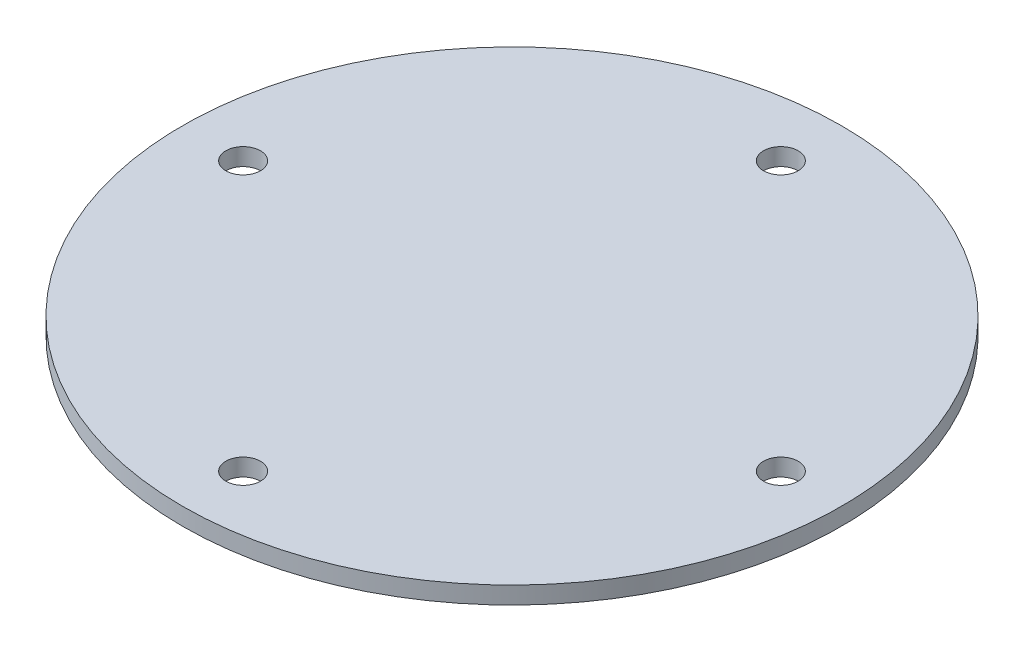
ISO-10303-21;
HEADER;
FILE_DESCRIPTION(('STEP AP214'),'2;1');
FILE_NAME('part.step','',(''),(''),'','','');
FILE_SCHEMA(('AUTOMOTIVE_DESIGN { 1 0 10303 214 1 1 1 1 }'));
ENDSEC;
DATA;
#1=APPLICATION_CONTEXT('core data for automotive mechanical design processes');
#2=APPLICATION_PROTOCOL_DEFINITION('international standard','automotive_design',2000,#1);
#3=PRODUCT_CONTEXT('',#1,'mechanical');
#4=PRODUCT('Part','Part','',(#3));
#5=PRODUCT_RELATED_PRODUCT_CATEGORY('part','',(#4));
#6=PRODUCT_DEFINITION_FORMATION('','',#4);
#7=PRODUCT_DEFINITION_CONTEXT('part definition',#1,'design');
#8=PRODUCT_DEFINITION('design','',#6,#7);
#9=PRODUCT_DEFINITION_SHAPE('','',#8);
#10=(LENGTH_UNIT() NAMED_UNIT(*) SI_UNIT(.MILLI.,.METRE.));
#11=(NAMED_UNIT(*) PLANE_ANGLE_UNIT() SI_UNIT($,.RADIAN.));
#12=(NAMED_UNIT(*) SI_UNIT($,.STERADIAN.) SOLID_ANGLE_UNIT());
#13=UNCERTAINTY_MEASURE_WITH_UNIT(LENGTH_MEASURE(1.E-05),#10,'distance_accuracy_value','');
#14=(GEOMETRIC_REPRESENTATION_CONTEXT(3) GLOBAL_UNCERTAINTY_ASSIGNED_CONTEXT((#13)) GLOBAL_UNIT_ASSIGNED_CONTEXT((#10,
#11,#12)) REPRESENTATION_CONTEXT('',''));
#15=CARTESIAN_POINT('',(0.,0.,0.));
#16=DIRECTION('',(0.,0.,1.));
#17=DIRECTION('',(1.,0.,0.));
#18=AXIS2_PLACEMENT_3D('',#15,#16,#17);
#19=CARTESIAN_POINT('',(0.,-8.,0.));
#20=DIRECTION('',(0.,1.,0.));
#21=DIRECTION('',(0.,0.,1.));
#22=AXIS2_PLACEMENT_3D('',#19,#20,#21);
#23=CYLINDRICAL_SURFACE('',#22,23.5);
#24=CARTESIAN_POINT('',(0.,-8.,0.));
#25=DIRECTION('',(0.,1.,0.));
#26=DIRECTION('',(0.,0.,1.));
#27=AXIS2_PLACEMENT_3D('',#24,#25,#26);
#28=CIRCLE('',#27,23.5);
#29=CARTESIAN_POINT('',(0.,-8.,23.5));
#30=VERTEX_POINT('',#29);
#31=EDGE_CURVE('E10',#30,#30,#28,.T.);
#32=ORIENTED_EDGE('',*,*,#31,.T.);
#33=EDGE_LOOP('',(#32));
#34=FACE_BOUND('',#33,.T.);
#35=CARTESIAN_POINT('',(0.,-2.,0.));
#36=DIRECTION('',(0.,1.,0.));
#37=DIRECTION('',(0.,0.,1.));
#38=AXIS2_PLACEMENT_3D('',#35,#36,#37);
#39=CIRCLE('',#38,23.5);
#40=CARTESIAN_POINT('',(0.,-2.,23.5));
#41=VERTEX_POINT('',#40);
#42=EDGE_CURVE('E34',#41,#41,#39,.F.);
#43=ORIENTED_EDGE('',*,*,#42,.T.);
#44=EDGE_LOOP('',(#43));
#45=FACE_BOUND('',#44,.T.);
#46=ADVANCED_FACE('F31',(#34,#45),#23,.T.);
#47=CARTESIAN_POINT('',(0.,-8.,0.));
#48=DIRECTION('',(0.,1.,0.));
#49=DIRECTION('',(0.,0.,1.));
#50=AXIS2_PLACEMENT_3D('',#47,#48,#49);
#51=PLANE('',#50);
#52=CARTESIAN_POINT('',(0.,-8.,0.));
#53=DIRECTION('',(0.,1.,0.));
#54=DIRECTION('',(0.,0.,1.));
#55=AXIS2_PLACEMENT_3D('',#52,#53,#54);
#56=CIRCLE('',#55,15.);
#57=CARTESIAN_POINT('',(0.,-8.,15.));
#58=VERTEX_POINT('',#57);
#59=EDGE_CURVE('E46',#58,#58,#56,.T.);
#60=ORIENTED_EDGE('',*,*,#59,.T.);
#61=EDGE_LOOP('',(#60));
#62=FACE_BOUND('',#61,.T.);
#63=ORIENTED_EDGE('',*,*,#31,.F.);
#64=EDGE_LOOP('',(#63));
#65=FACE_BOUND('',#64,.T.);
#66=ADVANCED_FACE('F97',(#62,#65),#51,.F.);
#67=CARTESIAN_POINT('',(0.,-2.,0.));
#68=DIRECTION('',(0.,1.,0.));
#69=DIRECTION('',(0.,0.,1.));
#70=AXIS2_PLACEMENT_3D('',#67,#68,#69);
#71=CYLINDRICAL_SURFACE('',#70,38.);
#72=CARTESIAN_POINT('',(0.,-2.,0.));
#73=DIRECTION('',(0.,1.,0.));
#74=DIRECTION('',(0.,0.,1.));
#75=AXIS2_PLACEMENT_3D('',#72,#73,#74);
#76=CIRCLE('',#75,38.);
#77=CARTESIAN_POINT('',(0.,-2.,38.));
#78=VERTEX_POINT('',#77);
#79=EDGE_CURVE('E41',#78,#78,#76,.T.);
#80=ORIENTED_EDGE('',*,*,#79,.T.);
#81=EDGE_LOOP('',(#80));
#82=FACE_BOUND('',#81,.T.);
#83=CARTESIAN_POINT('',(0.,0.,0.));
#84=DIRECTION('',(0.,1.,0.));
#85=DIRECTION('',(0.,0.,1.));
#86=AXIS2_PLACEMENT_3D('',#83,#84,#85);
#87=CIRCLE('',#86,38.);
#88=CARTESIAN_POINT('',(0.,0.,38.));
#89=VERTEX_POINT('',#88);
#90=EDGE_CURVE('E43',#89,#89,#87,.T.);
#91=ORIENTED_EDGE('',*,*,#90,.F.);
#92=EDGE_LOOP('',(#91));
#93=FACE_BOUND('',#92,.T.);
#94=ADVANCED_FACE('F95',(#82,#93),#71,.T.);
#95=CARTESIAN_POINT('',(0.,-2.,0.));
#96=DIRECTION('',(0.,1.,0.));
#97=DIRECTION('',(0.,0.,1.));
#98=AXIS2_PLACEMENT_3D('',#95,#96,#97);
#99=PLANE('',#98);
#100=CARTESIAN_POINT('',(-1.9789097605178E-13,-2.,-31.));
#101=DIRECTION('',(0.,1.,0.));
#102=DIRECTION('',(0.,0.,1.));
#103=AXIS2_PLACEMENT_3D('',#100,#101,#102);
#104=CIRCLE('',#103,2.00000000000146);
#105=CARTESIAN_POINT('',(-1.9789097605178E-13,-2.,-28.9999999999985));
#106=VERTEX_POINT('',#105);
#107=EDGE_CURVE('E52',#106,#106,#104,.T.);
#108=ORIENTED_EDGE('',*,*,#107,.T.);
#109=EDGE_LOOP('',(#108));
#110=FACE_BOUND('',#109,.T.);
#111=CARTESIAN_POINT('',(31.0000000000007,-2.,-8.75378384726489E-13));
#112=DIRECTION('',(0.,1.,0.));
#113=DIRECTION('',(0.,0.,1.));
#114=AXIS2_PLACEMENT_3D('',#111,#112,#113);
#115=CIRCLE('',#114,2.00000000000145);
#116=CARTESIAN_POINT('',(31.0000000000007,-2.,2.00000000000058));
#117=VERTEX_POINT('',#116);
#118=EDGE_CURVE('E57',#117,#117,#115,.T.);
#119=ORIENTED_EDGE('',*,*,#118,.T.);
#120=EDGE_LOOP('',(#119));
#121=FACE_BOUND('',#120,.T.);
#122=CARTESIAN_POINT('',(1.5528657934012E-12,-2.,31.));
#123=DIRECTION('',(0.,1.,0.));
#124=DIRECTION('',(0.,0.,1.));
#125=AXIS2_PLACEMENT_3D('',#122,#123,#124);
#126=CIRCLE('',#125,2.00000000000146);
#127=CARTESIAN_POINT('',(1.5528657934012E-12,-2.,33.0000000000015));
#128=VERTEX_POINT('',#127);
#129=EDGE_CURVE('E60',#128,#128,#126,.T.);
#130=ORIENTED_EDGE('',*,*,#129,.T.);
#131=EDGE_LOOP('',(#130));
#132=FACE_BOUND('',#131,.T.);
#133=CARTESIAN_POINT('',(-30.9999999999993,-2.,8.79174789803846E-13));
#134=DIRECTION('',(0.,1.,0.));
#135=DIRECTION('',(0.,0.,1.));
#136=AXIS2_PLACEMENT_3D('',#133,#134,#135);
#137=CIRCLE('',#136,2.00000000000145);
#138=CARTESIAN_POINT('',(-30.9999999999993,-2.,2.00000000000233));
#139=VERTEX_POINT('',#138);
#140=EDGE_CURVE('E63',#139,#139,#137,.T.);
#141=ORIENTED_EDGE('',*,*,#140,.T.);
#142=EDGE_LOOP('',(#141));
#143=FACE_BOUND('',#142,.T.);
#144=ORIENTED_EDGE('',*,*,#42,.F.);
#145=EDGE_LOOP('',(#144));
#146=FACE_BOUND('',#145,.T.);
#147=ORIENTED_EDGE('',*,*,#79,.F.);
#148=EDGE_LOOP('',(#147));
#149=FACE_BOUND('',#148,.T.);
#150=ADVANCED_FACE('F86',(#110,#121,#132,#143,#146,#149),#99,.F.);
#151=CARTESIAN_POINT('',(0.,0.,0.));
#152=DIRECTION('',(0.,1.,0.));
#153=DIRECTION('',(0.,0.,1.));
#154=AXIS2_PLACEMENT_3D('',#151,#152,#153);
#155=PLANE('',#154);
#156=CARTESIAN_POINT('',(-1.9789097605178E-13,0.,-31.));
#157=DIRECTION('',(0.,1.,0.));
#158=DIRECTION('',(0.,0.,1.));
#159=AXIS2_PLACEMENT_3D('',#156,#157,#158);
#160=CIRCLE('',#159,2.00000000000146);
#161=CARTESIAN_POINT('',(-1.9789097605178E-13,0.,-28.9999999999985));
#162=VERTEX_POINT('',#161);
#163=EDGE_CURVE('E66',#162,#162,#160,.T.);
#164=ORIENTED_EDGE('',*,*,#163,.F.);
#165=EDGE_LOOP('',(#164));
#166=FACE_BOUND('',#165,.T.);
#167=CARTESIAN_POINT('',(31.0000000000007,0.,-8.75378384726489E-13));
#168=DIRECTION('',(0.,1.,0.));
#169=DIRECTION('',(0.,0.,1.));
#170=AXIS2_PLACEMENT_3D('',#167,#168,#169);
#171=CIRCLE('',#170,2.00000000000145);
#172=CARTESIAN_POINT('',(31.0000000000007,0.,2.00000000000058));
#173=VERTEX_POINT('',#172);
#174=EDGE_CURVE('E73',#173,#173,#171,.T.);
#175=ORIENTED_EDGE('',*,*,#174,.F.);
#176=EDGE_LOOP('',(#175));
#177=FACE_BOUND('',#176,.T.);
#178=CARTESIAN_POINT('',(1.5528657934012E-12,0.,31.));
#179=DIRECTION('',(0.,1.,0.));
#180=DIRECTION('',(0.,0.,1.));
#181=AXIS2_PLACEMENT_3D('',#178,#179,#180);
#182=CIRCLE('',#181,2.00000000000146);
#183=CARTESIAN_POINT('',(1.5528657934012E-12,0.,33.0000000000015));
#184=VERTEX_POINT('',#183);
#185=EDGE_CURVE('E70',#184,#184,#182,.T.);
#186=ORIENTED_EDGE('',*,*,#185,.F.);
#187=EDGE_LOOP('',(#186));
#188=FACE_BOUND('',#187,.T.);
#189=CARTESIAN_POINT('',(-30.9999999999993,0.,8.79174789803846E-13));
#190=DIRECTION('',(0.,1.,0.));
#191=DIRECTION('',(0.,0.,1.));
#192=AXIS2_PLACEMENT_3D('',#189,#190,#191);
#193=CIRCLE('',#192,2.00000000000145);
#194=CARTESIAN_POINT('',(-30.9999999999993,0.,2.00000000000233));
#195=VERTEX_POINT('',#194);
#196=EDGE_CURVE('E67',#195,#195,#193,.T.);
#197=ORIENTED_EDGE('',*,*,#196,.F.);
#198=EDGE_LOOP('',(#197));
#199=FACE_BOUND('',#198,.T.);
#200=ORIENTED_EDGE('',*,*,#90,.T.);
#201=EDGE_LOOP('',(#200));
#202=FACE_BOUND('',#201,.T.);
#203=ADVANCED_FACE('F82',(#166,#177,#188,#199,#202),#155,.T.);
#204=CARTESIAN_POINT('',(0.,-8.,0.));
#205=DIRECTION('',(0.,1.,0.));
#206=DIRECTION('',(0.,0.,1.));
#207=AXIS2_PLACEMENT_3D('',#204,#205,#206);
#208=CYLINDRICAL_SURFACE('',#207,15.);
#209=ORIENTED_EDGE('',*,*,#59,.F.);
#210=EDGE_LOOP('',(#209));
#211=FACE_BOUND('',#210,.T.);
#212=CARTESIAN_POINT('',(0.,-2.,0.));
#213=DIRECTION('',(0.,1.,0.));
#214=DIRECTION('',(0.,0.,1.));
#215=AXIS2_PLACEMENT_3D('',#212,#213,#214);
#216=CIRCLE('',#215,15.);
#217=CARTESIAN_POINT('',(0.,-2.,15.));
#218=VERTEX_POINT('',#217);
#219=EDGE_CURVE('E49',#218,#218,#216,.T.);
#220=ORIENTED_EDGE('',*,*,#219,.T.);
#221=EDGE_LOOP('',(#220));
#222=FACE_BOUND('',#221,.T.);
#223=ADVANCED_FACE('F85',(#211,#222),#208,.F.);
#224=CARTESIAN_POINT('',(0.,-2.,0.));
#225=DIRECTION('',(0.,1.,0.));
#226=DIRECTION('',(0.,0.,1.));
#227=AXIS2_PLACEMENT_3D('',#224,#225,#226);
#228=PLANE('',#227);
#229=ORIENTED_EDGE('',*,*,#219,.F.);
#230=EDGE_LOOP('',(#229));
#231=FACE_BOUND('',#230,.T.);
#232=ADVANCED_FACE('F132',(#231),#228,.F.);
#233=CARTESIAN_POINT('',(-30.9999999999993,-8.,8.79174789803846E-13));
#234=DIRECTION('',(0.,1.,0.));
#235=DIRECTION('',(0.,0.,1.));
#236=AXIS2_PLACEMENT_3D('',#233,#234,#235);
#237=CYLINDRICAL_SURFACE('',#236,2.00000000000145);
#238=ORIENTED_EDGE('',*,*,#196,.T.);
#239=EDGE_LOOP('',(#238));
#240=FACE_BOUND('',#239,.T.);
#241=ORIENTED_EDGE('',*,*,#140,.F.);
#242=EDGE_LOOP('',(#241));
#243=FACE_BOUND('',#242,.T.);
#244=ADVANCED_FACE('F143',(#240,#243),#237,.F.);
#245=CARTESIAN_POINT('',(1.5528657934012E-12,-8.,31.));
#246=DIRECTION('',(0.,1.,0.));
#247=DIRECTION('',(0.,0.,1.));
#248=AXIS2_PLACEMENT_3D('',#245,#246,#247);
#249=CYLINDRICAL_SURFACE('',#248,2.00000000000146);
#250=ORIENTED_EDGE('',*,*,#185,.T.);
#251=EDGE_LOOP('',(#250));
#252=FACE_BOUND('',#251,.T.);
#253=ORIENTED_EDGE('',*,*,#129,.F.);
#254=EDGE_LOOP('',(#253));
#255=FACE_BOUND('',#254,.T.);
#256=ADVANCED_FACE('F164',(#252,#255),#249,.F.);
#257=CARTESIAN_POINT('',(31.0000000000007,-8.,-8.75378384726489E-13));
#258=DIRECTION('',(0.,1.,0.));
#259=DIRECTION('',(0.,0.,1.));
#260=AXIS2_PLACEMENT_3D('',#257,#258,#259);
#261=CYLINDRICAL_SURFACE('',#260,2.00000000000145);
#262=ORIENTED_EDGE('',*,*,#174,.T.);
#263=EDGE_LOOP('',(#262));
#264=FACE_BOUND('',#263,.T.);
#265=ORIENTED_EDGE('',*,*,#118,.F.);
#266=EDGE_LOOP('',(#265));
#267=FACE_BOUND('',#266,.T.);
#268=ADVANCED_FACE('F174',(#264,#267),#261,.F.);
#269=CARTESIAN_POINT('',(-1.9789097605178E-13,-8.,-31.));
#270=DIRECTION('',(0.,1.,0.));
#271=DIRECTION('',(0.,0.,1.));
#272=AXIS2_PLACEMENT_3D('',#269,#270,#271);
#273=CYLINDRICAL_SURFACE('',#272,2.00000000000146);
#274=ORIENTED_EDGE('',*,*,#163,.T.);
#275=EDGE_LOOP('',(#274));
#276=FACE_BOUND('',#275,.T.);
#277=ORIENTED_EDGE('',*,*,#107,.F.);
#278=EDGE_LOOP('',(#277));
#279=FACE_BOUND('',#278,.T.);
#280=ADVANCED_FACE('F79',(#276,#279),#273,.F.);
#281=CLOSED_SHELL('',(#46,#66,#94,#150,#203,#223,#232,#244,#256,#268,#280));
#282=MANIFOLD_SOLID_BREP('B2',#281);
#283=ADVANCED_BREP_SHAPE_REPRESENTATION('',(#18,#282),#14);
#284=SHAPE_DEFINITION_REPRESENTATION(#9,#283);
ENDSEC;
END-ISO-10303-21;
